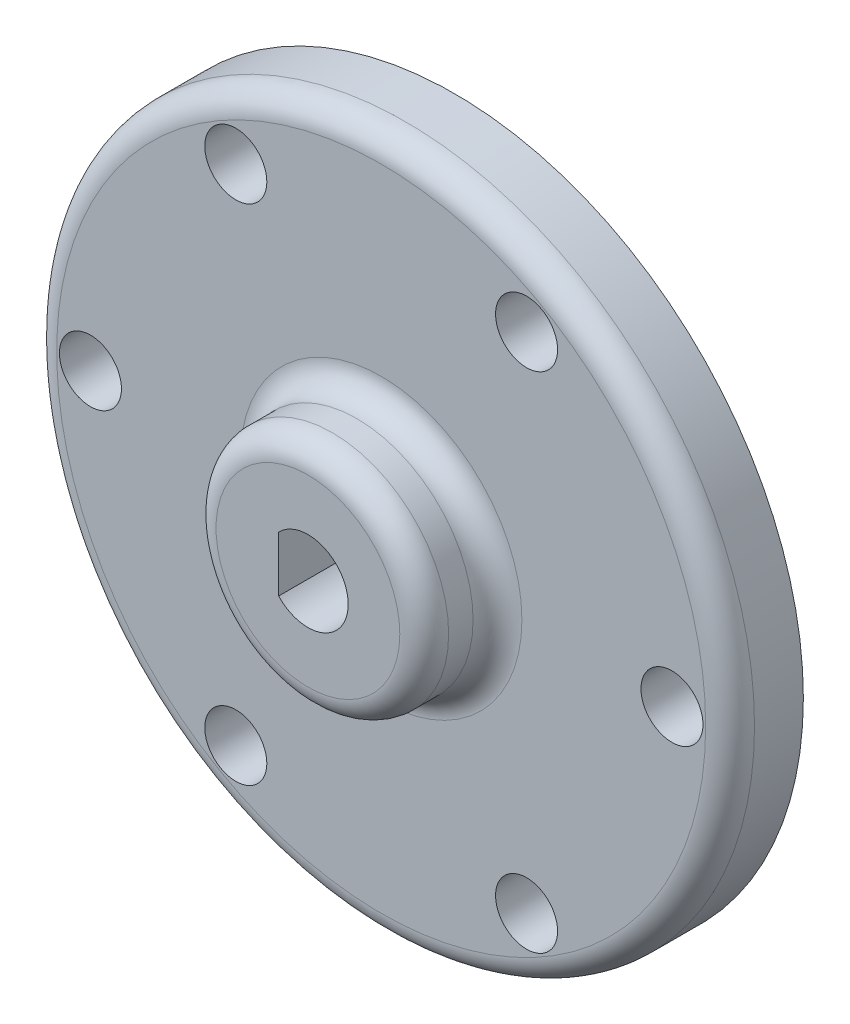
ISO-10303-21;
HEADER;
FILE_DESCRIPTION(('STEP AP214'),'2;1');
FILE_NAME('part.step','',(''),(''),'','','');
FILE_SCHEMA(('AUTOMOTIVE_DESIGN { 1 0 10303 214 1 1 1 1 }'));
ENDSEC;
DATA;
#1=APPLICATION_CONTEXT('core data for automotive mechanical design processes');
#2=APPLICATION_PROTOCOL_DEFINITION('international standard','automotive_design',2000,#1);
#3=PRODUCT_CONTEXT('',#1,'mechanical');
#4=PRODUCT('Part','Part','',(#3));
#5=PRODUCT_RELATED_PRODUCT_CATEGORY('part','',(#4));
#6=PRODUCT_DEFINITION_FORMATION('','',#4);
#7=PRODUCT_DEFINITION_CONTEXT('part definition',#1,'design');
#8=PRODUCT_DEFINITION('design','',#6,#7);
#9=PRODUCT_DEFINITION_SHAPE('','',#8);
#10=(LENGTH_UNIT() NAMED_UNIT(*) SI_UNIT(.MILLI.,.METRE.));
#11=(NAMED_UNIT(*) PLANE_ANGLE_UNIT() SI_UNIT($,.RADIAN.));
#12=(NAMED_UNIT(*) SI_UNIT($,.STERADIAN.) SOLID_ANGLE_UNIT());
#13=UNCERTAINTY_MEASURE_WITH_UNIT(LENGTH_MEASURE(1.E-05),#10,'distance_accuracy_value','');
#14=(GEOMETRIC_REPRESENTATION_CONTEXT(3) GLOBAL_UNCERTAINTY_ASSIGNED_CONTEXT((#13)) GLOBAL_UNIT_ASSIGNED_CONTEXT((#10,
#11,#12)) REPRESENTATION_CONTEXT('',''));
#15=CARTESIAN_POINT('',(0.,0.,0.));
#16=DIRECTION('',(0.,0.,1.));
#17=DIRECTION('',(1.,0.,0.));
#18=AXIS2_PLACEMENT_3D('',#15,#16,#17);
#19=CARTESIAN_POINT('',(0.,0.,3.));
#20=DIRECTION('',(0.,0.,1.));
#21=DIRECTION('',(1.,0.,0.));
#22=AXIS2_PLACEMENT_3D('',#19,#20,#21);
#23=PLANE('',#22);
#24=CARTESIAN_POINT('',(0.,0.,3.));
#25=DIRECTION('',(0.,0.,1.));
#26=DIRECTION('',(1.,0.,0.));
#27=AXIS2_PLACEMENT_3D('',#24,#25,#26);
#28=CIRCLE('',#27,26.575);
#29=CARTESIAN_POINT('',(26.575,0.,3.));
#30=VERTEX_POINT('',#29);
#31=EDGE_CURVE('E121',#30,#30,#28,.T.);
#32=ORIENTED_EDGE('',*,*,#31,.T.);
#33=EDGE_LOOP('',(#32));
#34=FACE_BOUND('',#33,.T.);
#35=CARTESIAN_POINT('',(0.,0.,3.));
#36=DIRECTION('',(0.,0.,1.));
#37=DIRECTION('',(1.,0.,0.));
#38=AXIS2_PLACEMENT_3D('',#35,#36,#37);
#39=CIRCLE('',#38,11.525);
#40=CARTESIAN_POINT('',(11.525,0.,3.));
#41=VERTEX_POINT('',#40);
#42=EDGE_CURVE('E118',#41,#41,#39,.F.);
#43=ORIENTED_EDGE('',*,*,#42,.T.);
#44=EDGE_LOOP('',(#43));
#45=FACE_BOUND('',#44,.T.);
#46=CARTESIAN_POINT('',(11.9062499999998,-20.6222299276171,3.));
#47=DIRECTION('',(0.,0.,1.));
#48=DIRECTION('',(1.,0.,0.));
#49=AXIS2_PLACEMENT_3D('',#46,#47,#48);
#50=CIRCLE('',#49,2.54);
#51=CARTESIAN_POINT('',(14.4462499999998,-20.6222299276171,3.));
#52=VERTEX_POINT('',#51);
#53=EDGE_CURVE('E86',#52,#52,#50,.T.);
#54=ORIENTED_EDGE('',*,*,#53,.F.);
#55=EDGE_LOOP('',(#54));
#56=FACE_BOUND('',#55,.T.);
#57=CARTESIAN_POINT('',(11.9062500000001,20.6222299276169,3.));
#58=DIRECTION('',(0.,0.,1.));
#59=DIRECTION('',(1.,0.,0.));
#60=AXIS2_PLACEMENT_3D('',#57,#58,#59);
#61=CIRCLE('',#60,2.54000000000001);
#62=CARTESIAN_POINT('',(14.4462500000001,20.6222299276169,3.));
#63=VERTEX_POINT('',#62);
#64=EDGE_CURVE('E98',#63,#63,#61,.T.);
#65=ORIENTED_EDGE('',*,*,#64,.F.);
#66=EDGE_LOOP('',(#65));
#67=FACE_BOUND('',#66,.T.);
#68=CARTESIAN_POINT('',(-23.8125,0.,3.));
#69=DIRECTION('',(0.,0.,1.));
#70=DIRECTION('',(1.,0.,0.));
#71=AXIS2_PLACEMENT_3D('',#68,#69,#70);
#72=CIRCLE('',#71,2.54);
#73=CARTESIAN_POINT('',(-21.2725,0.,3.));
#74=VERTEX_POINT('',#73);
#75=EDGE_CURVE('E110',#74,#74,#72,.T.);
#76=ORIENTED_EDGE('',*,*,#75,.F.);
#77=EDGE_LOOP('',(#76));
#78=FACE_BOUND('',#77,.T.);
#79=CARTESIAN_POINT('',(-11.90625,20.622229927617,3.));
#80=DIRECTION('',(0.,0.,1.));
#81=DIRECTION('',(1.,0.,0.));
#82=AXIS2_PLACEMENT_3D('',#79,#80,#81);
#83=CIRCLE('',#82,2.54);
#84=CARTESIAN_POINT('',(-9.36624999999995,20.622229927617,3.));
#85=VERTEX_POINT('',#84);
#86=EDGE_CURVE('E104',#85,#85,#83,.T.);
#87=ORIENTED_EDGE('',*,*,#86,.F.);
#88=EDGE_LOOP('',(#87));
#89=FACE_BOUND('',#88,.T.);
#90=CARTESIAN_POINT('',(23.8125,-1.66281798762404E-13,3.));
#91=DIRECTION('',(0.,0.,1.));
#92=DIRECTION('',(1.,0.,0.));
#93=AXIS2_PLACEMENT_3D('',#90,#91,#92);
#94=CIRCLE('',#93,2.54);
#95=CARTESIAN_POINT('',(26.3525,-1.66281798762404E-13,3.));
#96=VERTEX_POINT('',#95);
#97=EDGE_CURVE('E92',#96,#96,#94,.T.);
#98=ORIENTED_EDGE('',*,*,#97,.F.);
#99=EDGE_LOOP('',(#98));
#100=FACE_BOUND('',#99,.T.);
#101=CARTESIAN_POINT('',(-11.9062500000002,-20.6222299276168,3.));
#102=DIRECTION('',(0.,0.,1.));
#103=DIRECTION('',(1.,0.,0.));
#104=AXIS2_PLACEMENT_3D('',#101,#102,#103);
#105=CIRCLE('',#104,2.54);
#106=CARTESIAN_POINT('',(-9.36625000000024,-20.6222299276168,3.));
#107=VERTEX_POINT('',#106);
#108=EDGE_CURVE('E80',#107,#107,#105,.T.);
#109=ORIENTED_EDGE('',*,*,#108,.F.);
#110=EDGE_LOOP('',(#109));
#111=FACE_BOUND('',#110,.T.);
#112=ADVANCED_FACE('F33',(#34,#45,#56,#67,#78,#89,#100,#111),#23,.T.);
#113=CARTESIAN_POINT('',(0.,0.,-3.));
#114=DIRECTION('',(0.,0.,1.));
#115=DIRECTION('',(1.,0.,0.));
#116=AXIS2_PLACEMENT_3D('',#113,#114,#115);
#117=PLANE('',#116);
#118=CARTESIAN_POINT('',(0.,0.,-3.));
#119=DIRECTION('',(0.,0.,1.));
#120=DIRECTION('',(1.,0.,0.));
#121=AXIS2_PLACEMENT_3D('',#118,#119,#120);
#122=CIRCLE('',#121,3.3);
#123=CARTESIAN_POINT('',(-2.4,2.26495033058123,-3.));
#124=VERTEX_POINT('',#123);
#125=CARTESIAN_POINT('',(-2.4,-2.26495033058123,-3.));
#126=VERTEX_POINT('',#125);
#127=EDGE_CURVE('E68',#124,#126,#122,.F.);
#128=ORIENTED_EDGE('',*,*,#127,.F.);
#129=DIRECTION('',(0.,1.,0.));
#130=VECTOR('',#129,1.);
#131=CARTESIAN_POINT('',(-2.4,0.,-3.));
#132=LINE('',#131,#130);
#133=EDGE_CURVE('E48',#126,#124,#132,.T.);
#134=ORIENTED_EDGE('',*,*,#133,.F.);
#135=EDGE_LOOP('',(#128,#134));
#136=FACE_BOUND('',#135,.T.);
#137=CARTESIAN_POINT('',(0.,0.,-3.));
#138=DIRECTION('',(0.,0.,1.));
#139=DIRECTION('',(1.,0.,0.));
#140=AXIS2_PLACEMENT_3D('',#137,#138,#139);
#141=CIRCLE('',#140,28.575);
#142=CARTESIAN_POINT('',(28.575,0.,-3.));
#143=VERTEX_POINT('',#142);
#144=EDGE_CURVE('E113',#143,#143,#141,.T.);
#145=ORIENTED_EDGE('',*,*,#144,.F.);
#146=EDGE_LOOP('',(#145));
#147=FACE_BOUND('',#146,.T.);
#148=CARTESIAN_POINT('',(-23.8125,0.,-3.));
#149=DIRECTION('',(0.,0.,1.));
#150=DIRECTION('',(1.,0.,0.));
#151=AXIS2_PLACEMENT_3D('',#148,#149,#150);
#152=CIRCLE('',#151,2.54);
#153=CARTESIAN_POINT('',(-21.2725,0.,-3.));
#154=VERTEX_POINT('',#153);
#155=EDGE_CURVE('E107',#154,#154,#152,.T.);
#156=ORIENTED_EDGE('',*,*,#155,.T.);
#157=EDGE_LOOP('',(#156));
#158=FACE_BOUND('',#157,.T.);
#159=CARTESIAN_POINT('',(-11.90625,20.622229927617,-3.));
#160=DIRECTION('',(0.,0.,1.));
#161=DIRECTION('',(1.,0.,0.));
#162=AXIS2_PLACEMENT_3D('',#159,#160,#161);
#163=CIRCLE('',#162,2.54);
#164=CARTESIAN_POINT('',(-9.36624999999995,20.622229927617,-3.));
#165=VERTEX_POINT('',#164);
#166=EDGE_CURVE('E101',#165,#165,#163,.T.);
#167=ORIENTED_EDGE('',*,*,#166,.T.);
#168=EDGE_LOOP('',(#167));
#169=FACE_BOUND('',#168,.T.);
#170=CARTESIAN_POINT('',(11.9062500000001,20.6222299276169,-3.));
#171=DIRECTION('',(0.,0.,1.));
#172=DIRECTION('',(1.,0.,0.));
#173=AXIS2_PLACEMENT_3D('',#170,#171,#172);
#174=CIRCLE('',#173,2.54000000000001);
#175=CARTESIAN_POINT('',(14.4462500000001,20.6222299276169,-3.));
#176=VERTEX_POINT('',#175);
#177=EDGE_CURVE('E95',#176,#176,#174,.T.);
#178=ORIENTED_EDGE('',*,*,#177,.T.);
#179=EDGE_LOOP('',(#178));
#180=FACE_BOUND('',#179,.T.);
#181=CARTESIAN_POINT('',(23.8125,-1.66281798762404E-13,-3.));
#182=DIRECTION('',(0.,0.,1.));
#183=DIRECTION('',(1.,0.,0.));
#184=AXIS2_PLACEMENT_3D('',#181,#182,#183);
#185=CIRCLE('',#184,2.54);
#186=CARTESIAN_POINT('',(26.3525,-1.66281798762404E-13,-3.));
#187=VERTEX_POINT('',#186);
#188=EDGE_CURVE('E89',#187,#187,#185,.T.);
#189=ORIENTED_EDGE('',*,*,#188,.T.);
#190=EDGE_LOOP('',(#189));
#191=FACE_BOUND('',#190,.T.);
#192=CARTESIAN_POINT('',(11.9062499999998,-20.6222299276171,-3.));
#193=DIRECTION('',(0.,0.,1.));
#194=DIRECTION('',(1.,0.,0.));
#195=AXIS2_PLACEMENT_3D('',#192,#193,#194);
#196=CIRCLE('',#195,2.54);
#197=CARTESIAN_POINT('',(14.4462499999998,-20.6222299276171,-3.));
#198=VERTEX_POINT('',#197);
#199=EDGE_CURVE('E83',#198,#198,#196,.T.);
#200=ORIENTED_EDGE('',*,*,#199,.T.);
#201=EDGE_LOOP('',(#200));
#202=FACE_BOUND('',#201,.T.);
#203=CARTESIAN_POINT('',(-11.9062500000002,-20.6222299276168,-3.));
#204=DIRECTION('',(0.,0.,1.));
#205=DIRECTION('',(1.,0.,0.));
#206=AXIS2_PLACEMENT_3D('',#203,#204,#205);
#207=CIRCLE('',#206,2.54);
#208=CARTESIAN_POINT('',(-9.36625000000024,-20.6222299276168,-3.));
#209=VERTEX_POINT('',#208);
#210=EDGE_CURVE('E71',#209,#209,#207,.T.);
#211=ORIENTED_EDGE('',*,*,#210,.T.);
#212=EDGE_LOOP('',(#211));
#213=FACE_BOUND('',#212,.T.);
#214=ADVANCED_FACE('F73',(#136,#147,#158,#169,#180,#191,#202,#213),#117,.F.);
#215=CARTESIAN_POINT('',(0.,0.,3.));
#216=DIRECTION('',(0.,0.,-1.));
#217=DIRECTION('',(-1.,0.,0.));
#218=AXIS2_PLACEMENT_3D('',#215,#216,#217);
#219=CYLINDRICAL_SURFACE('',#218,28.575);
#220=CARTESIAN_POINT('',(0.,0.,1.));
#221=DIRECTION('',(0.,0.,1.));
#222=DIRECTION('',(1.,0.,0.));
#223=AXIS2_PLACEMENT_3D('',#220,#221,#222);
#224=CIRCLE('',#223,28.575);
#225=CARTESIAN_POINT('',(28.575,0.,1.));
#226=VERTEX_POINT('',#225);
#227=EDGE_CURVE('E124',#226,#226,#224,.F.);
#228=ORIENTED_EDGE('',*,*,#227,.T.);
#229=EDGE_LOOP('',(#228));
#230=FACE_BOUND('',#229,.T.);
#231=ORIENTED_EDGE('',*,*,#144,.T.);
#232=EDGE_LOOP('',(#231));
#233=FACE_BOUND('',#232,.T.);
#234=ADVANCED_FACE('F149',(#230,#233),#219,.T.);
#235=CARTESIAN_POINT('',(-23.8125,0.,3.));
#236=DIRECTION('',(0.,0.,-1.));
#237=DIRECTION('',(-1.,0.,0.));
#238=AXIS2_PLACEMENT_3D('',#235,#236,#237);
#239=CYLINDRICAL_SURFACE('',#238,2.54);
#240=ORIENTED_EDGE('',*,*,#75,.T.);
#241=EDGE_LOOP('',(#240));
#242=FACE_BOUND('',#241,.T.);
#243=ORIENTED_EDGE('',*,*,#155,.F.);
#244=EDGE_LOOP('',(#243));
#245=FACE_BOUND('',#244,.T.);
#246=ADVANCED_FACE('F153',(#242,#245),#239,.F.);
#247=CARTESIAN_POINT('',(-11.90625,20.622229927617,3.));
#248=DIRECTION('',(0.,0.,-1.));
#249=DIRECTION('',(-1.,0.,0.));
#250=AXIS2_PLACEMENT_3D('',#247,#248,#249);
#251=CYLINDRICAL_SURFACE('',#250,2.54);
#252=ORIENTED_EDGE('',*,*,#86,.T.);
#253=EDGE_LOOP('',(#252));
#254=FACE_BOUND('',#253,.T.);
#255=ORIENTED_EDGE('',*,*,#166,.F.);
#256=EDGE_LOOP('',(#255));
#257=FACE_BOUND('',#256,.T.);
#258=ADVANCED_FACE('F205',(#254,#257),#251,.F.);
#259=CARTESIAN_POINT('',(11.9062500000001,20.6222299276169,3.));
#260=DIRECTION('',(0.,0.,-1.));
#261=DIRECTION('',(-1.,0.,0.));
#262=AXIS2_PLACEMENT_3D('',#259,#260,#261);
#263=CYLINDRICAL_SURFACE('',#262,2.54000000000001);
#264=ORIENTED_EDGE('',*,*,#64,.T.);
#265=EDGE_LOOP('',(#264));
#266=FACE_BOUND('',#265,.T.);
#267=ORIENTED_EDGE('',*,*,#177,.F.);
#268=EDGE_LOOP('',(#267));
#269=FACE_BOUND('',#268,.T.);
#270=ADVANCED_FACE('F202',(#266,#269),#263,.F.);
#271=CARTESIAN_POINT('',(23.8125,-1.66281798762404E-13,3.));
#272=DIRECTION('',(0.,0.,-1.));
#273=DIRECTION('',(-1.,0.,0.));
#274=AXIS2_PLACEMENT_3D('',#271,#272,#273);
#275=CYLINDRICAL_SURFACE('',#274,2.54);
#276=ORIENTED_EDGE('',*,*,#97,.T.);
#277=EDGE_LOOP('',(#276));
#278=FACE_BOUND('',#277,.T.);
#279=ORIENTED_EDGE('',*,*,#188,.F.);
#280=EDGE_LOOP('',(#279));
#281=FACE_BOUND('',#280,.T.);
#282=ADVANCED_FACE('F195',(#278,#281),#275,.F.);
#283=CARTESIAN_POINT('',(11.9062499999998,-20.6222299276171,3.));
#284=DIRECTION('',(0.,0.,-1.));
#285=DIRECTION('',(-1.,0.,0.));
#286=AXIS2_PLACEMENT_3D('',#283,#284,#285);
#287=CYLINDRICAL_SURFACE('',#286,2.54);
#288=ORIENTED_EDGE('',*,*,#53,.T.);
#289=EDGE_LOOP('',(#288));
#290=FACE_BOUND('',#289,.T.);
#291=ORIENTED_EDGE('',*,*,#199,.F.);
#292=EDGE_LOOP('',(#291));
#293=FACE_BOUND('',#292,.T.);
#294=ADVANCED_FACE('F185',(#290,#293),#287,.F.);
#295=CARTESIAN_POINT('',(-11.9062500000002,-20.6222299276168,3.));
#296=DIRECTION('',(0.,0.,-1.));
#297=DIRECTION('',(-1.,0.,0.));
#298=AXIS2_PLACEMENT_3D('',#295,#296,#297);
#299=CYLINDRICAL_SURFACE('',#298,2.54);
#300=ORIENTED_EDGE('',*,*,#108,.T.);
#301=EDGE_LOOP('',(#300));
#302=FACE_BOUND('',#301,.T.);
#303=ORIENTED_EDGE('',*,*,#210,.F.);
#304=EDGE_LOOP('',(#303));
#305=FACE_BOUND('',#304,.T.);
#306=ADVANCED_FACE('F183',(#302,#305),#299,.F.);
#307=CARTESIAN_POINT('',(0.,0.,9.));
#308=DIRECTION('',(0.,0.,-1.));
#309=DIRECTION('',(-1.,0.,0.));
#310=AXIS2_PLACEMENT_3D('',#307,#308,#309);
#311=CYLINDRICAL_SURFACE('',#310,9.525);
#312=CARTESIAN_POINT('',(0.,0.,7.));
#313=DIRECTION('',(0.,0.,1.));
#314=DIRECTION('',(1.,0.,0.));
#315=AXIS2_PLACEMENT_3D('',#312,#313,#314);
#316=CIRCLE('',#315,9.525);
#317=CARTESIAN_POINT('',(9.525,0.,7.));
#318=VERTEX_POINT('',#317);
#319=EDGE_CURVE('E11',#318,#318,#316,.F.);
#320=ORIENTED_EDGE('',*,*,#319,.T.);
#321=EDGE_LOOP('',(#320));
#322=FACE_BOUND('',#321,.T.);
#323=CARTESIAN_POINT('',(0.,0.,5.));
#324=DIRECTION('',(0.,0.,1.));
#325=DIRECTION('',(1.,0.,0.));
#326=AXIS2_PLACEMENT_3D('',#323,#324,#325);
#327=CIRCLE('',#326,9.525);
#328=CARTESIAN_POINT('',(9.525,0.,5.));
#329=VERTEX_POINT('',#328);
#330=EDGE_CURVE('E41',#329,#329,#327,.T.);
#331=ORIENTED_EDGE('',*,*,#330,.T.);
#332=EDGE_LOOP('',(#331));
#333=FACE_BOUND('',#332,.T.);
#334=ADVANCED_FACE('F132',(#322,#333),#311,.T.);
#335=CARTESIAN_POINT('',(0.,0.,9.));
#336=DIRECTION('',(0.,0.,1.));
#337=DIRECTION('',(1.,0.,0.));
#338=AXIS2_PLACEMENT_3D('',#335,#336,#337);
#339=PLANE('',#338);
#340=CARTESIAN_POINT('',(0.,0.,9.));
#341=DIRECTION('',(0.,0.,1.));
#342=DIRECTION('',(1.,0.,0.));
#343=AXIS2_PLACEMENT_3D('',#340,#341,#342);
#344=CIRCLE('',#343,7.525);
#345=CARTESIAN_POINT('',(7.525,0.,9.));
#346=VERTEX_POINT('',#345);
#347=EDGE_CURVE('E127',#346,#346,#344,.T.);
#348=ORIENTED_EDGE('',*,*,#347,.T.);
#349=EDGE_LOOP('',(#348));
#350=FACE_BOUND('',#349,.T.);
#351=DIRECTION('',(0.,-1.,0.));
#352=VECTOR('',#351,1.);
#353=CARTESIAN_POINT('',(-2.4,0.,9.));
#354=LINE('',#353,#352);
#355=CARTESIAN_POINT('',(-2.4,2.26495033058122,9.));
#356=VERTEX_POINT('',#355);
#357=CARTESIAN_POINT('',(-2.4,-2.26495033058123,9.));
#358=VERTEX_POINT('',#357);
#359=EDGE_CURVE('E53',#356,#358,#354,.T.);
#360=ORIENTED_EDGE('',*,*,#359,.F.);
#361=CARTESIAN_POINT('',(0.,0.,9.));
#362=DIRECTION('',(0.,0.,1.));
#363=DIRECTION('',(1.,0.,0.));
#364=AXIS2_PLACEMENT_3D('',#361,#362,#363);
#365=CIRCLE('',#364,3.3);
#366=EDGE_CURVE('E65',#358,#356,#365,.T.);
#367=ORIENTED_EDGE('',*,*,#366,.F.);
#368=EDGE_LOOP('',(#360,#367));
#369=FACE_BOUND('',#368,.T.);
#370=ADVANCED_FACE('F192',(#350,#369),#339,.T.);
#371=CARTESIAN_POINT('',(-2.4,0.,-3.001));
#372=DIRECTION('',(-1.,0.,0.));
#373=DIRECTION('',(0.,0.,1.));
#374=AXIS2_PLACEMENT_3D('',#371,#372,#373);
#375=PLANE('',#374);
#376=ORIENTED_EDGE('',*,*,#133,.T.);
#377=DIRECTION('',(0.,0.,1.));
#378=VECTOR('',#377,1.);
#379=CARTESIAN_POINT('',(-2.4,2.26495033058122,-3.001));
#380=LINE('',#379,#378);
#381=EDGE_CURVE('E64',#124,#356,#380,.T.);
#382=ORIENTED_EDGE('',*,*,#381,.T.);
#383=ORIENTED_EDGE('',*,*,#359,.T.);
#384=DIRECTION('',(0.,0.,1.));
#385=VECTOR('',#384,1.);
#386=CARTESIAN_POINT('',(-2.4,-2.26495033058122,-3.001));
#387=LINE('',#386,#385);
#388=EDGE_CURVE('E58',#126,#358,#387,.T.);
#389=ORIENTED_EDGE('',*,*,#388,.F.);
#390=EDGE_LOOP('',(#376,#382,#383,#389));
#391=FACE_BOUND('',#390,.T.);
#392=ADVANCED_FACE('F60',(#391),#375,.F.);
#393=CARTESIAN_POINT('',(0.,0.,-3.001));
#394=DIRECTION('',(0.,0.,1.));
#395=DIRECTION('',(1.,0.,0.));
#396=AXIS2_PLACEMENT_3D('',#393,#394,#395);
#397=CYLINDRICAL_SURFACE('',#396,3.3);
#398=ORIENTED_EDGE('',*,*,#127,.T.);
#399=ORIENTED_EDGE('',*,*,#388,.T.);
#400=ORIENTED_EDGE('',*,*,#366,.T.);
#401=ORIENTED_EDGE('',*,*,#381,.F.);
#402=EDGE_LOOP('',(#398,#399,#400,#401));
#403=FACE_BOUND('',#402,.T.);
#404=ADVANCED_FACE('F69',(#403),#397,.F.);
#405=CARTESIAN_POINT('',(0.,0.,1.));
#406=DIRECTION('',(0.,0.,1.));
#407=DIRECTION('',(1.,0.,0.));
#408=AXIS2_PLACEMENT_3D('',#405,#406,#407);
#409=TOROIDAL_SURFACE('',#408,26.575,2.);
#410=ORIENTED_EDGE('',*,*,#227,.F.);
#411=EDGE_LOOP('',(#410));
#412=FACE_BOUND('',#411,.T.);
#413=ORIENTED_EDGE('',*,*,#31,.F.);
#414=EDGE_LOOP('',(#413));
#415=FACE_BOUND('',#414,.T.);
#416=ADVANCED_FACE('F140',(#412,#415),#409,.T.);
#417=CARTESIAN_POINT('',(0.,0.,7.));
#418=DIRECTION('',(0.,0.,1.));
#419=DIRECTION('',(1.,0.,0.));
#420=AXIS2_PLACEMENT_3D('',#417,#418,#419);
#421=TOROIDAL_SURFACE('',#420,7.525,2.);
#422=ORIENTED_EDGE('',*,*,#319,.F.);
#423=EDGE_LOOP('',(#422));
#424=FACE_BOUND('',#423,.T.);
#425=ORIENTED_EDGE('',*,*,#347,.F.);
#426=EDGE_LOOP('',(#425));
#427=FACE_BOUND('',#426,.T.);
#428=ADVANCED_FACE('F135',(#424,#427),#421,.T.);
#429=CARTESIAN_POINT('',(0.,0.,5.));
#430=DIRECTION('',(0.,0.,1.));
#431=DIRECTION('',(1.,0.,0.));
#432=AXIS2_PLACEMENT_3D('',#429,#430,#431);
#433=TOROIDAL_SURFACE('',#432,11.525,2.);
#434=ORIENTED_EDGE('',*,*,#42,.F.);
#435=EDGE_LOOP('',(#434));
#436=FACE_BOUND('',#435,.T.);
#437=ORIENTED_EDGE('',*,*,#330,.F.);
#438=EDGE_LOOP('',(#437));
#439=FACE_BOUND('',#438,.T.);
#440=ADVANCED_FACE('F35',(#436,#439),#433,.F.);
#441=CLOSED_SHELL('',(#112,#214,#234,#246,#258,#270,#282,#294,#306,#334,#370,#392,#404,#416,
#428,#440));
#442=MANIFOLD_SOLID_BREP('B2',#441);
#443=ADVANCED_BREP_SHAPE_REPRESENTATION('',(#18,#442),#14);
#444=SHAPE_DEFINITION_REPRESENTATION(#9,#443);
ENDSEC;
END-ISO-10303-21;
